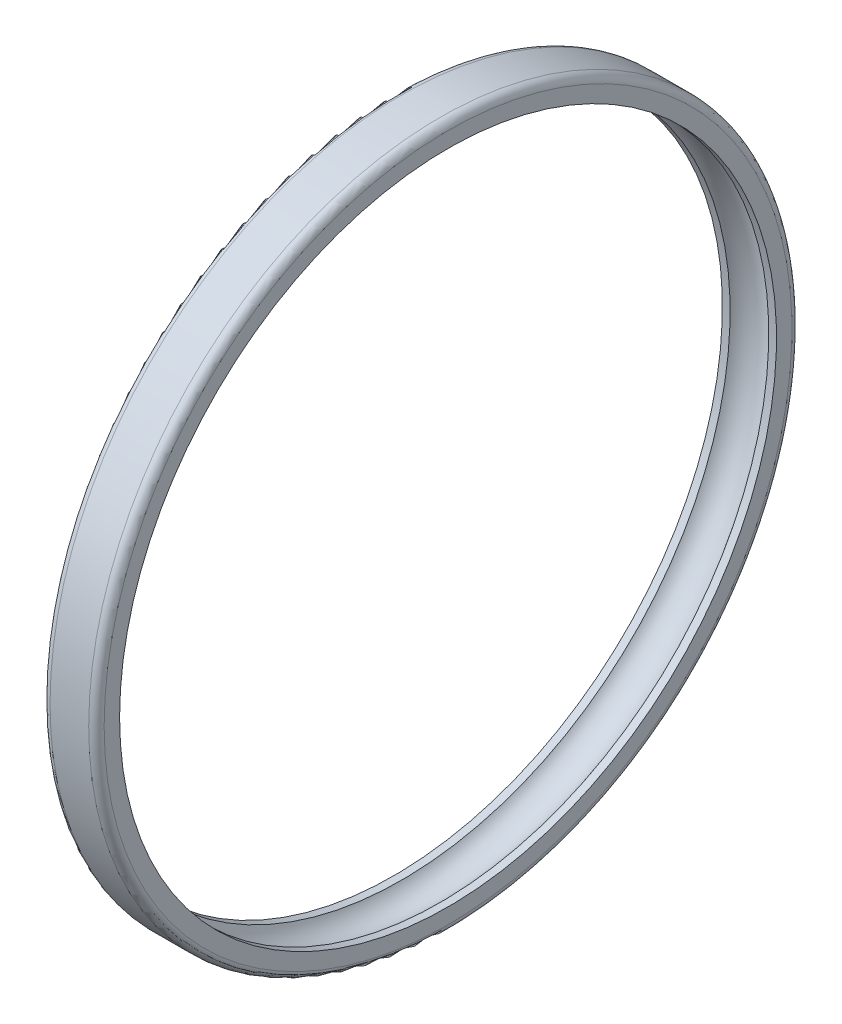
ISO-10303-21;
HEADER;
FILE_DESCRIPTION(('STEP AP214'),'2;1');
FILE_NAME('part.step','',(''),(''),'','','');
FILE_SCHEMA(('AUTOMOTIVE_DESIGN { 1 0 10303 214 1 1 1 1 }'));
ENDSEC;
DATA;
#1=APPLICATION_CONTEXT('core data for automotive mechanical design processes');
#2=APPLICATION_PROTOCOL_DEFINITION('international standard','automotive_design',2000,#1);
#3=PRODUCT_CONTEXT('',#1,'mechanical');
#4=PRODUCT('Part','Part','',(#3));
#5=PRODUCT_RELATED_PRODUCT_CATEGORY('part','',(#4));
#6=PRODUCT_DEFINITION_FORMATION('','',#4);
#7=PRODUCT_DEFINITION_CONTEXT('part definition',#1,'design');
#8=PRODUCT_DEFINITION('design','',#6,#7);
#9=PRODUCT_DEFINITION_SHAPE('','',#8);
#10=(LENGTH_UNIT() NAMED_UNIT(*) SI_UNIT(.MILLI.,.METRE.));
#11=(NAMED_UNIT(*) PLANE_ANGLE_UNIT() SI_UNIT($,.RADIAN.));
#12=(NAMED_UNIT(*) SI_UNIT($,.STERADIAN.) SOLID_ANGLE_UNIT());
#13=UNCERTAINTY_MEASURE_WITH_UNIT(LENGTH_MEASURE(1.E-05),#10,'distance_accuracy_value','');
#14=(GEOMETRIC_REPRESENTATION_CONTEXT(3) GLOBAL_UNCERTAINTY_ASSIGNED_CONTEXT((#13)) GLOBAL_UNIT_ASSIGNED_CONTEXT((#10,
#11,#12)) REPRESENTATION_CONTEXT('',''));
#15=CARTESIAN_POINT('',(0.,0.,0.));
#16=DIRECTION('',(0.,0.,1.));
#17=DIRECTION('',(1.,0.,0.));
#18=AXIS2_PLACEMENT_3D('',#15,#16,#17);
#19=CARTESIAN_POINT('',(44.45,565.15,0.));
#20=DIRECTION('',(-1.,0.,0.));
#21=DIRECTION('',(0.,0.,1.));
#22=AXIS2_PLACEMENT_3D('',#19,#20,#21);
#23=PLANE('',#22);
#24=CARTESIAN_POINT('',(44.4500000000001,0.,0.));
#25=DIRECTION('',(-1.,0.,0.));
#26=DIRECTION('',(0.,0.,1.));
#27=AXIS2_PLACEMENT_3D('',#24,#25,#26);
#28=CIRCLE('',#27,565.15);
#29=CARTESIAN_POINT('',(44.4500000000001,0.,565.15));
#30=VERTEX_POINT('',#29);
#31=EDGE_CURVE('E10',#30,#30,#28,.T.);
#32=ORIENTED_EDGE('',*,*,#31,.F.);
#33=EDGE_LOOP('',(#32));
#34=FACE_BOUND('',#33,.T.);
#35=CARTESIAN_POINT('',(44.45,0.,0.));
#36=DIRECTION('',(-1.,0.,0.));
#37=DIRECTION('',(0.,0.,1.));
#38=AXIS2_PLACEMENT_3D('',#35,#36,#37);
#39=CIRCLE('',#38,539.75);
#40=CARTESIAN_POINT('',(44.45,0.,539.75));
#41=VERTEX_POINT('',#40);
#42=EDGE_CURVE('E61',#41,#41,#39,.T.);
#43=ORIENTED_EDGE('',*,*,#42,.T.);
#44=EDGE_LOOP('',(#43));
#45=FACE_BOUND('',#44,.T.);
#46=ADVANCED_FACE('F33',(#34,#45),#23,.F.);
#47=CARTESIAN_POINT('',(31.75,0.,0.));
#48=DIRECTION('',(-1.,0.,0.));
#49=DIRECTION('',(0.,0.,1.));
#50=AXIS2_PLACEMENT_3D('',#47,#48,#49);
#51=TOROIDAL_SURFACE('',#50,565.15,12.7);
#52=CARTESIAN_POINT('',(31.7500000000001,0.,0.));
#53=DIRECTION('',(-1.,0.,0.));
#54=DIRECTION('',(0.,0.,1.));
#55=AXIS2_PLACEMENT_3D('',#52,#53,#54);
#56=CIRCLE('',#55,577.85);
#57=CARTESIAN_POINT('',(31.7500000000001,0.,577.85));
#58=VERTEX_POINT('',#57);
#59=EDGE_CURVE('E39',#58,#58,#56,.T.);
#60=ORIENTED_EDGE('',*,*,#59,.F.);
#61=EDGE_LOOP('',(#60));
#62=FACE_BOUND('',#61,.T.);
#63=ORIENTED_EDGE('',*,*,#31,.T.);
#64=EDGE_LOOP('',(#63));
#65=FACE_BOUND('',#64,.T.);
#66=ADVANCED_FACE('F98',(#62,#65),#51,.T.);
#67=CARTESIAN_POINT('',(-592.78233151184,0.,0.));
#68=DIRECTION('',(-1.,0.,0.));
#69=DIRECTION('',(0.,0.,1.));
#70=AXIS2_PLACEMENT_3D('',#67,#68,#69);
#71=CYLINDRICAL_SURFACE('',#70,577.85);
#72=CARTESIAN_POINT('',(-31.7499999999999,0.,0.));
#73=DIRECTION('',(-1.,0.,0.));
#74=DIRECTION('',(0.,0.,1.));
#75=AXIS2_PLACEMENT_3D('',#72,#73,#74);
#76=CIRCLE('',#75,577.85);
#77=CARTESIAN_POINT('',(-31.7499999999999,0.,577.85));
#78=VERTEX_POINT('',#77);
#79=EDGE_CURVE('E43',#78,#78,#76,.T.);
#80=ORIENTED_EDGE('',*,*,#79,.F.);
#81=EDGE_LOOP('',(#80));
#82=FACE_BOUND('',#81,.T.);
#83=ORIENTED_EDGE('',*,*,#59,.T.);
#84=EDGE_LOOP('',(#83));
#85=FACE_BOUND('',#84,.T.);
#86=ADVANCED_FACE('F93',(#82,#85),#71,.T.);
#87=CARTESIAN_POINT('',(-31.75,0.,0.));
#88=DIRECTION('',(-1.,0.,0.));
#89=DIRECTION('',(0.,0.,1.));
#90=AXIS2_PLACEMENT_3D('',#87,#88,#89);
#91=TOROIDAL_SURFACE('',#90,565.15,12.7);
#92=CARTESIAN_POINT('',(-44.45,0.,0.));
#93=DIRECTION('',(-1.,0.,0.));
#94=DIRECTION('',(0.,0.,1.));
#95=AXIS2_PLACEMENT_3D('',#92,#93,#94);
#96=CIRCLE('',#95,565.15);
#97=CARTESIAN_POINT('',(-44.45,0.,565.15));
#98=VERTEX_POINT('',#97);
#99=EDGE_CURVE('E47',#98,#98,#96,.T.);
#100=ORIENTED_EDGE('',*,*,#99,.F.);
#101=EDGE_LOOP('',(#100));
#102=FACE_BOUND('',#101,.T.);
#103=ORIENTED_EDGE('',*,*,#79,.T.);
#104=EDGE_LOOP('',(#103));
#105=FACE_BOUND('',#104,.T.);
#106=ADVANCED_FACE('F87',(#102,#105),#91,.T.);
#107=CARTESIAN_POINT('',(-44.45,565.15,0.));
#108=DIRECTION('',(1.,0.,0.));
#109=DIRECTION('',(0.,0.,-1.));
#110=AXIS2_PLACEMENT_3D('',#107,#108,#109);
#111=PLANE('',#110);
#112=CARTESIAN_POINT('',(-44.45,0.,0.));
#113=DIRECTION('',(-1.,0.,0.));
#114=DIRECTION('',(0.,0.,1.));
#115=AXIS2_PLACEMENT_3D('',#112,#113,#114);
#116=CIRCLE('',#115,539.75);
#117=CARTESIAN_POINT('',(-44.45,0.,539.75));
#118=VERTEX_POINT('',#117);
#119=EDGE_CURVE('E52',#118,#118,#116,.T.);
#120=ORIENTED_EDGE('',*,*,#119,.F.);
#121=EDGE_LOOP('',(#120));
#122=FACE_BOUND('',#121,.T.);
#123=ORIENTED_EDGE('',*,*,#99,.T.);
#124=EDGE_LOOP('',(#123));
#125=FACE_BOUND('',#124,.T.);
#126=ADVANCED_FACE('F81',(#122,#125),#111,.F.);
#127=CARTESIAN_POINT('',(-592.78233151184,0.,0.));
#128=DIRECTION('',(-1.,0.,0.));
#129=DIRECTION('',(0.,0.,1.));
#130=AXIS2_PLACEMENT_3D('',#127,#128,#129);
#131=CYLINDRICAL_SURFACE('',#130,539.75);
#132=CARTESIAN_POINT('',(-31.7499999999999,0.,0.));
#133=DIRECTION('',(-1.,0.,0.));
#134=DIRECTION('',(0.,0.,1.));
#135=AXIS2_PLACEMENT_3D('',#132,#133,#134);
#136=CIRCLE('',#135,539.75);
#137=CARTESIAN_POINT('',(-31.7499999999999,0.,539.75));
#138=VERTEX_POINT('',#137);
#139=EDGE_CURVE('E55',#138,#138,#136,.T.);
#140=ORIENTED_EDGE('',*,*,#139,.F.);
#141=EDGE_LOOP('',(#140));
#142=FACE_BOUND('',#141,.T.);
#143=ORIENTED_EDGE('',*,*,#119,.T.);
#144=EDGE_LOOP('',(#143));
#145=FACE_BOUND('',#144,.T.);
#146=ADVANCED_FACE('F75',(#142,#145),#131,.F.);
#147=CARTESIAN_POINT('',(0.,0.,0.));
#148=DIRECTION('',(-1.,0.,0.));
#149=DIRECTION('',(0.,0.,1.));
#150=AXIS2_PLACEMENT_3D('',#147,#148,#149);
#151=TOROIDAL_SURFACE('',#150,518.689432581243,38.1);
#152=CARTESIAN_POINT('',(31.7500000000001,0.,0.));
#153=DIRECTION('',(-1.,0.,0.));
#154=DIRECTION('',(0.,0.,1.));
#155=AXIS2_PLACEMENT_3D('',#152,#153,#154);
#156=CIRCLE('',#155,539.75);
#157=CARTESIAN_POINT('',(31.7500000000001,0.,539.75));
#158=VERTEX_POINT('',#157);
#159=EDGE_CURVE('E58',#158,#158,#156,.T.);
#160=ORIENTED_EDGE('',*,*,#159,.F.);
#161=EDGE_LOOP('',(#160));
#162=FACE_BOUND('',#161,.T.);
#163=ORIENTED_EDGE('',*,*,#139,.T.);
#164=EDGE_LOOP('',(#163));
#165=FACE_BOUND('',#164,.T.);
#166=ADVANCED_FACE('F69',(#162,#165),#151,.F.);
#167=CARTESIAN_POINT('',(-592.78233151184,0.,0.));
#168=DIRECTION('',(-1.,0.,0.));
#169=DIRECTION('',(0.,0.,1.));
#170=AXIS2_PLACEMENT_3D('',#167,#168,#169);
#171=CYLINDRICAL_SURFACE('',#170,539.75);
#172=ORIENTED_EDGE('',*,*,#42,.F.);
#173=EDGE_LOOP('',(#172));
#174=FACE_BOUND('',#173,.T.);
#175=ORIENTED_EDGE('',*,*,#159,.T.);
#176=EDGE_LOOP('',(#175));
#177=FACE_BOUND('',#176,.T.);
#178=ADVANCED_FACE('F66',(#174,#177),#171,.F.);
#179=CLOSED_SHELL('',(#46,#66,#86,#106,#126,#146,#166,#178));
#180=MANIFOLD_SOLID_BREP('B2',#179);
#181=ADVANCED_BREP_SHAPE_REPRESENTATION('',(#18,#180),#14);
#182=SHAPE_DEFINITION_REPRESENTATION(#9,#181);
ENDSEC;
END-ISO-10303-21;
